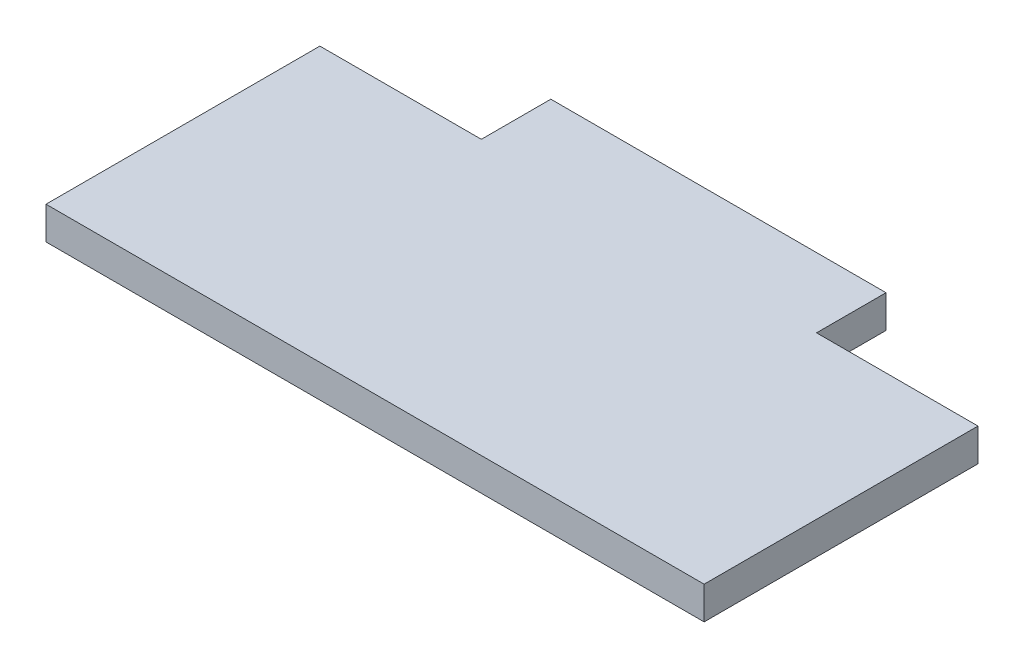
ISO-10303-21;
HEADER;
FILE_DESCRIPTION(('STEP AP214'),'2;1');
FILE_NAME('part.step','',(''),(''),'','','');
FILE_SCHEMA(('AUTOMOTIVE_DESIGN { 1 0 10303 214 1 1 1 1 }'));
ENDSEC;
DATA;
#1=APPLICATION_CONTEXT('core data for automotive mechanical design processes');
#2=APPLICATION_PROTOCOL_DEFINITION('international standard','automotive_design',2000,#1);
#3=PRODUCT_CONTEXT('',#1,'mechanical');
#4=PRODUCT('Part','Part','',(#3));
#5=PRODUCT_RELATED_PRODUCT_CATEGORY('part','',(#4));
#6=PRODUCT_DEFINITION_FORMATION('','',#4);
#7=PRODUCT_DEFINITION_CONTEXT('part definition',#1,'design');
#8=PRODUCT_DEFINITION('design','',#6,#7);
#9=PRODUCT_DEFINITION_SHAPE('','',#8);
#10=(LENGTH_UNIT() NAMED_UNIT(*) SI_UNIT(.MILLI.,.METRE.));
#11=(NAMED_UNIT(*) PLANE_ANGLE_UNIT() SI_UNIT($,.RADIAN.));
#12=(NAMED_UNIT(*) SI_UNIT($,.STERADIAN.) SOLID_ANGLE_UNIT());
#13=UNCERTAINTY_MEASURE_WITH_UNIT(LENGTH_MEASURE(1.E-05),#10,'distance_accuracy_value','');
#14=(GEOMETRIC_REPRESENTATION_CONTEXT(3) GLOBAL_UNCERTAINTY_ASSIGNED_CONTEXT((#13)) GLOBAL_UNIT_ASSIGNED_CONTEXT((#10,
#11,#12)) REPRESENTATION_CONTEXT('',''));
#15=CARTESIAN_POINT('',(0.,0.,0.));
#16=DIRECTION('',(0.,0.,1.));
#17=DIRECTION('',(1.,0.,0.));
#18=AXIS2_PLACEMENT_3D('',#15,#16,#17);
#19=CARTESIAN_POINT('',(-127.79375,12.7,0.));
#20=DIRECTION('',(1.,0.,0.));
#21=DIRECTION('',(0.,0.,-1.));
#22=AXIS2_PLACEMENT_3D('',#19,#20,#21);
#23=PLANE('',#22);
#24=DIRECTION('',(0.,0.,1.));
#25=VECTOR('',#24,1.);
#26=CARTESIAN_POINT('',(-127.79375,0.,0.));
#27=LINE('',#26,#25);
#28=CARTESIAN_POINT('',(-127.79375,0.,0.));
#29=VERTEX_POINT('',#28);
#30=CARTESIAN_POINT('',(-127.79375,0.,106.3625));
#31=VERTEX_POINT('',#30);
#32=EDGE_CURVE('E129',#29,#31,#27,.T.);
#33=ORIENTED_EDGE('',*,*,#32,.T.);
#34=DIRECTION('',(0.,-1.,0.));
#35=VECTOR('',#34,1.);
#36=CARTESIAN_POINT('',(-127.79375,12.7,106.3625));
#37=LINE('',#36,#35);
#38=CARTESIAN_POINT('',(-127.79375,12.7,106.3625));
#39=VERTEX_POINT('',#38);
#40=EDGE_CURVE('E11',#39,#31,#37,.T.);
#41=ORIENTED_EDGE('',*,*,#40,.F.);
#42=DIRECTION('',(0.,0.,1.));
#43=VECTOR('',#42,1.);
#44=CARTESIAN_POINT('',(-127.79375,12.7,0.));
#45=LINE('',#44,#43);
#46=CARTESIAN_POINT('',(-127.79375,12.7,0.));
#47=VERTEX_POINT('',#46);
#48=EDGE_CURVE('E143',#47,#39,#45,.T.);
#49=ORIENTED_EDGE('',*,*,#48,.F.);
#50=DIRECTION('',(0.,-1.,0.));
#51=VECTOR('',#50,1.);
#52=CARTESIAN_POINT('',(-127.79375,12.7,0.));
#53=LINE('',#52,#51);
#54=EDGE_CURVE('E125',#47,#29,#53,.T.);
#55=ORIENTED_EDGE('',*,*,#54,.T.);
#56=EDGE_LOOP('',(#33,#41,#49,#55));
#57=FACE_BOUND('',#56,.T.);
#58=ADVANCED_FACE('F33',(#57),#23,.F.);
#59=CARTESIAN_POINT('',(-127.79375,12.7,106.3625));
#60=DIRECTION('',(0.,0.,-1.));
#61=DIRECTION('',(-1.,0.,0.));
#62=AXIS2_PLACEMENT_3D('',#59,#60,#61);
#63=PLANE('',#62);
#64=DIRECTION('',(1.,0.,0.));
#65=VECTOR('',#64,1.);
#66=CARTESIAN_POINT('',(-127.79375,0.,106.3625));
#67=LINE('',#66,#65);
#68=CARTESIAN_POINT('',(127.79375,0.,106.3625));
#69=VERTEX_POINT('',#68);
#70=EDGE_CURVE('E132',#31,#69,#67,.T.);
#71=ORIENTED_EDGE('',*,*,#70,.T.);
#72=DIRECTION('',(0.,-1.,0.));
#73=VECTOR('',#72,1.);
#74=CARTESIAN_POINT('',(127.79375,12.7,106.3625));
#75=LINE('',#74,#73);
#76=CARTESIAN_POINT('',(127.79375,12.7,106.3625));
#77=VERTEX_POINT('',#76);
#78=EDGE_CURVE('E41',#77,#69,#75,.T.);
#79=ORIENTED_EDGE('',*,*,#78,.F.);
#80=DIRECTION('',(1.,0.,0.));
#81=VECTOR('',#80,1.);
#82=CARTESIAN_POINT('',(-127.79375,12.7,106.3625));
#83=LINE('',#82,#81);
#84=EDGE_CURVE('E92',#39,#77,#83,.T.);
#85=ORIENTED_EDGE('',*,*,#84,.F.);
#86=ORIENTED_EDGE('',*,*,#40,.T.);
#87=EDGE_LOOP('',(#71,#79,#85,#86));
#88=FACE_BOUND('',#87,.T.);
#89=ADVANCED_FACE('F178',(#88),#63,.F.);
#90=CARTESIAN_POINT('',(127.79375,12.7,0.));
#91=DIRECTION('',(-1.,0.,0.));
#92=DIRECTION('',(0.,0.,1.));
#93=AXIS2_PLACEMENT_3D('',#90,#91,#92);
#94=PLANE('',#93);
#95=DIRECTION('',(0.,0.,-1.));
#96=VECTOR('',#95,1.);
#97=CARTESIAN_POINT('',(127.79375,0.,0.));
#98=LINE('',#97,#96);
#99=CARTESIAN_POINT('',(127.79375,0.,0.));
#100=VERTEX_POINT('',#99);
#101=EDGE_CURVE('E134',#69,#100,#98,.T.);
#102=ORIENTED_EDGE('',*,*,#101,.T.);
#103=DIRECTION('',(0.,-1.,0.));
#104=VECTOR('',#103,1.);
#105=CARTESIAN_POINT('',(127.79375,12.7,0.));
#106=LINE('',#105,#104);
#107=CARTESIAN_POINT('',(127.79375,12.7,0.));
#108=VERTEX_POINT('',#107);
#109=EDGE_CURVE('E150',#108,#100,#106,.T.);
#110=ORIENTED_EDGE('',*,*,#109,.F.);
#111=DIRECTION('',(0.,0.,-1.));
#112=VECTOR('',#111,1.);
#113=CARTESIAN_POINT('',(127.79375,12.7,0.));
#114=LINE('',#113,#112);
#115=EDGE_CURVE('E158',#77,#108,#114,.T.);
#116=ORIENTED_EDGE('',*,*,#115,.F.);
#117=ORIENTED_EDGE('',*,*,#78,.T.);
#118=EDGE_LOOP('',(#102,#110,#116,#117));
#119=FACE_BOUND('',#118,.T.);
#120=ADVANCED_FACE('F156',(#119),#94,.F.);
#121=CARTESIAN_POINT('',(65.0875,12.7,0.));
#122=DIRECTION('',(0.,0.,1.));
#123=DIRECTION('',(1.,0.,0.));
#124=AXIS2_PLACEMENT_3D('',#121,#122,#123);
#125=PLANE('',#124);
#126=DIRECTION('',(-1.,0.,0.));
#127=VECTOR('',#126,1.);
#128=CARTESIAN_POINT('',(65.0875,0.,0.));
#129=LINE('',#128,#127);
#130=CARTESIAN_POINT('',(65.0875,0.,0.));
#131=VERTEX_POINT('',#130);
#132=EDGE_CURVE('E136',#100,#131,#129,.T.);
#133=ORIENTED_EDGE('',*,*,#132,.T.);
#134=DIRECTION('',(0.,-1.,0.));
#135=VECTOR('',#134,1.);
#136=CARTESIAN_POINT('',(65.0875,12.7,0.));
#137=LINE('',#136,#135);
#138=CARTESIAN_POINT('',(65.0875,12.7,0.));
#139=VERTEX_POINT('',#138);
#140=EDGE_CURVE('E147',#139,#131,#137,.T.);
#141=ORIENTED_EDGE('',*,*,#140,.F.);
#142=DIRECTION('',(-1.,0.,0.));
#143=VECTOR('',#142,1.);
#144=CARTESIAN_POINT('',(65.0875,12.7,0.));
#145=LINE('',#144,#143);
#146=EDGE_CURVE('E170',#108,#139,#145,.T.);
#147=ORIENTED_EDGE('',*,*,#146,.F.);
#148=ORIENTED_EDGE('',*,*,#109,.T.);
#149=EDGE_LOOP('',(#133,#141,#147,#148));
#150=FACE_BOUND('',#149,.T.);
#151=ADVANCED_FACE('F166',(#150),#125,.F.);
#152=CARTESIAN_POINT('',(65.0875,12.7,-26.9875));
#153=DIRECTION('',(-1.,0.,0.));
#154=DIRECTION('',(0.,0.,1.));
#155=AXIS2_PLACEMENT_3D('',#152,#153,#154);
#156=PLANE('',#155);
#157=DIRECTION('',(0.,0.,-1.));
#158=VECTOR('',#157,1.);
#159=CARTESIAN_POINT('',(65.0875,0.,-26.9875));
#160=LINE('',#159,#158);
#161=CARTESIAN_POINT('',(65.0875,0.,-26.9875));
#162=VERTEX_POINT('',#161);
#163=EDGE_CURVE('E138',#131,#162,#160,.T.);
#164=ORIENTED_EDGE('',*,*,#163,.T.);
#165=DIRECTION('',(0.,-1.,0.));
#166=VECTOR('',#165,1.);
#167=CARTESIAN_POINT('',(65.0875,12.7,-26.9875));
#168=LINE('',#167,#166);
#169=CARTESIAN_POINT('',(65.0875,12.7,-26.9875));
#170=VERTEX_POINT('',#169);
#171=EDGE_CURVE('E120',#170,#162,#168,.T.);
#172=ORIENTED_EDGE('',*,*,#171,.F.);
#173=DIRECTION('',(0.,0.,-1.));
#174=VECTOR('',#173,1.);
#175=CARTESIAN_POINT('',(65.0875,12.7,-26.9875));
#176=LINE('',#175,#174);
#177=EDGE_CURVE('E111',#139,#170,#176,.T.);
#178=ORIENTED_EDGE('',*,*,#177,.F.);
#179=ORIENTED_EDGE('',*,*,#140,.T.);
#180=EDGE_LOOP('',(#164,#172,#178,#179));
#181=FACE_BOUND('',#180,.T.);
#182=ADVANCED_FACE('F169',(#181),#156,.F.);
#183=CARTESIAN_POINT('',(-65.0875,12.7,-26.9875));
#184=DIRECTION('',(0.,0.,1.));
#185=DIRECTION('',(1.,0.,0.));
#186=AXIS2_PLACEMENT_3D('',#183,#184,#185);
#187=PLANE('',#186);
#188=DIRECTION('',(-1.,0.,0.));
#189=VECTOR('',#188,1.);
#190=CARTESIAN_POINT('',(-65.0875,0.,-26.9875));
#191=LINE('',#190,#189);
#192=CARTESIAN_POINT('',(-65.0875,0.,-26.9875));
#193=VERTEX_POINT('',#192);
#194=EDGE_CURVE('E119',#162,#193,#191,.T.);
#195=ORIENTED_EDGE('',*,*,#194,.T.);
#196=DIRECTION('',(0.,-1.,0.));
#197=VECTOR('',#196,1.);
#198=CARTESIAN_POINT('',(-65.0875,12.7,-26.9875));
#199=LINE('',#198,#197);
#200=CARTESIAN_POINT('',(-65.0875,12.7,-26.9875));
#201=VERTEX_POINT('',#200);
#202=EDGE_CURVE('E116',#201,#193,#199,.T.);
#203=ORIENTED_EDGE('',*,*,#202,.F.);
#204=DIRECTION('',(-1.,0.,0.));
#205=VECTOR('',#204,1.);
#206=CARTESIAN_POINT('',(-65.0875,12.7,-26.9875));
#207=LINE('',#206,#205);
#208=EDGE_CURVE('E105',#170,#201,#207,.T.);
#209=ORIENTED_EDGE('',*,*,#208,.F.);
#210=ORIENTED_EDGE('',*,*,#171,.T.);
#211=EDGE_LOOP('',(#195,#203,#209,#210));
#212=FACE_BOUND('',#211,.T.);
#213=ADVANCED_FACE('F117',(#212),#187,.F.);
#214=CARTESIAN_POINT('',(-65.0875,12.7,0.));
#215=DIRECTION('',(1.,0.,0.));
#216=DIRECTION('',(0.,0.,-1.));
#217=AXIS2_PLACEMENT_3D('',#214,#215,#216);
#218=PLANE('',#217);
#219=DIRECTION('',(0.,0.,1.));
#220=VECTOR('',#219,1.);
#221=CARTESIAN_POINT('',(-65.0875,0.,0.));
#222=LINE('',#221,#220);
#223=CARTESIAN_POINT('',(-65.0875,0.,0.));
#224=VERTEX_POINT('',#223);
#225=EDGE_CURVE('E78',#193,#224,#222,.T.);
#226=ORIENTED_EDGE('',*,*,#225,.T.);
#227=DIRECTION('',(0.,-1.,0.));
#228=VECTOR('',#227,1.);
#229=CARTESIAN_POINT('',(-65.0875,12.7,0.));
#230=LINE('',#229,#228);
#231=CARTESIAN_POINT('',(-65.0875,12.7,0.));
#232=VERTEX_POINT('',#231);
#233=EDGE_CURVE('E121',#232,#224,#230,.T.);
#234=ORIENTED_EDGE('',*,*,#233,.F.);
#235=DIRECTION('',(0.,0.,1.));
#236=VECTOR('',#235,1.);
#237=CARTESIAN_POINT('',(-65.0875,12.7,0.));
#238=LINE('',#237,#236);
#239=EDGE_CURVE('E109',#201,#232,#238,.T.);
#240=ORIENTED_EDGE('',*,*,#239,.F.);
#241=ORIENTED_EDGE('',*,*,#202,.T.);
#242=EDGE_LOOP('',(#226,#234,#240,#241));
#243=FACE_BOUND('',#242,.T.);
#244=ADVANCED_FACE('F123',(#243),#218,.F.);
#245=CARTESIAN_POINT('',(-127.79375,12.7,0.));
#246=DIRECTION('',(0.,0.,1.));
#247=DIRECTION('',(1.,0.,0.));
#248=AXIS2_PLACEMENT_3D('',#245,#246,#247);
#249=PLANE('',#248);
#250=DIRECTION('',(-1.,0.,0.));
#251=VECTOR('',#250,1.);
#252=CARTESIAN_POINT('',(-127.79375,0.,0.));
#253=LINE('',#252,#251);
#254=EDGE_CURVE('E84',#224,#29,#253,.T.);
#255=ORIENTED_EDGE('',*,*,#254,.T.);
#256=ORIENTED_EDGE('',*,*,#54,.F.);
#257=DIRECTION('',(-1.,0.,0.));
#258=VECTOR('',#257,1.);
#259=CARTESIAN_POINT('',(-127.79375,12.7,0.));
#260=LINE('',#259,#258);
#261=EDGE_CURVE('E49',#232,#47,#260,.T.);
#262=ORIENTED_EDGE('',*,*,#261,.F.);
#263=ORIENTED_EDGE('',*,*,#233,.T.);
#264=EDGE_LOOP('',(#255,#256,#262,#263));
#265=FACE_BOUND('',#264,.T.);
#266=ADVANCED_FACE('F194',(#265),#249,.F.);
#267=CARTESIAN_POINT('',(0.,12.7,0.));
#268=DIRECTION('',(0.,1.,0.));
#269=DIRECTION('',(0.,0.,1.));
#270=AXIS2_PLACEMENT_3D('',#267,#268,#269);
#271=PLANE('',#270);
#272=ORIENTED_EDGE('',*,*,#48,.T.);
#273=ORIENTED_EDGE('',*,*,#84,.T.);
#274=ORIENTED_EDGE('',*,*,#115,.T.);
#275=ORIENTED_EDGE('',*,*,#146,.T.);
#276=ORIENTED_EDGE('',*,*,#177,.T.);
#277=ORIENTED_EDGE('',*,*,#208,.T.);
#278=ORIENTED_EDGE('',*,*,#239,.T.);
#279=ORIENTED_EDGE('',*,*,#261,.T.);
#280=EDGE_LOOP('',(#272,#273,#274,#275,#276,#277,#278,#279));
#281=FACE_BOUND('',#280,.T.);
#282=ADVANCED_FACE('F107',(#281),#271,.T.);
#283=CARTESIAN_POINT('',(0.,0.,0.));
#284=DIRECTION('',(0.,1.,0.));
#285=DIRECTION('',(0.,0.,1.));
#286=AXIS2_PLACEMENT_3D('',#283,#284,#285);
#287=PLANE('',#286);
#288=ORIENTED_EDGE('',*,*,#32,.F.);
#289=ORIENTED_EDGE('',*,*,#254,.F.);
#290=ORIENTED_EDGE('',*,*,#225,.F.);
#291=ORIENTED_EDGE('',*,*,#194,.F.);
#292=ORIENTED_EDGE('',*,*,#163,.F.);
#293=ORIENTED_EDGE('',*,*,#132,.F.);
#294=ORIENTED_EDGE('',*,*,#101,.F.);
#295=ORIENTED_EDGE('',*,*,#70,.F.);
#296=EDGE_LOOP('',(#288,#289,#290,#291,#292,#293,#294,#295));
#297=FACE_BOUND('',#296,.T.);
#298=ADVANCED_FACE('F162',(#297),#287,.F.);
#299=CLOSED_SHELL('',(#58,#89,#120,#151,#182,#213,#244,#266,#282,#298));
#300=MANIFOLD_SOLID_BREP('B2',#299);
#301=ADVANCED_BREP_SHAPE_REPRESENTATION('',(#18,#300),#14);
#302=SHAPE_DEFINITION_REPRESENTATION(#9,#301);
ENDSEC;
END-ISO-10303-21;
